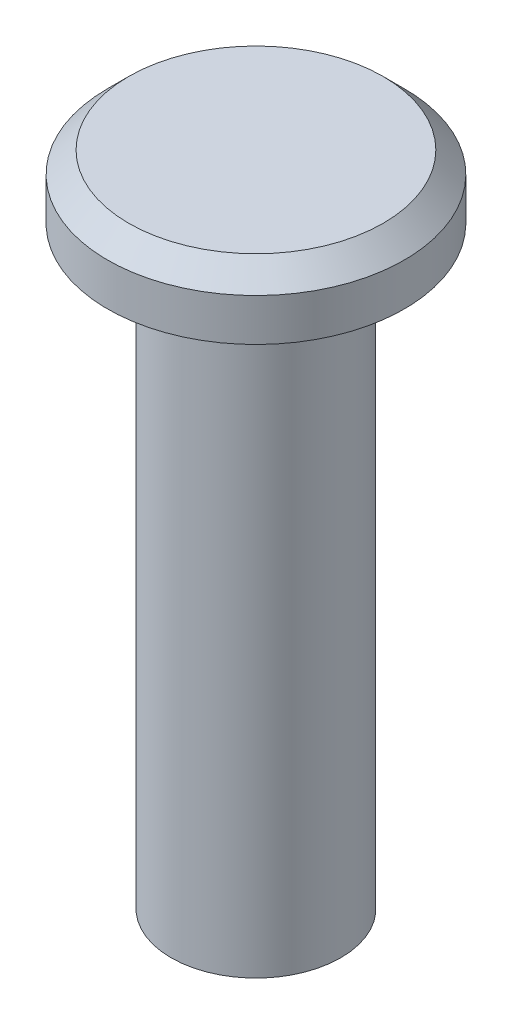
ISO-10303-21;
HEADER;
FILE_DESCRIPTION(('STEP AP214'),'2;1');
FILE_NAME('part.step','',(''),(''),'','','');
FILE_SCHEMA(('AUTOMOTIVE_DESIGN { 1 0 10303 214 1 1 1 1 }'));
ENDSEC;
DATA;
#1=APPLICATION_CONTEXT('core data for automotive mechanical design processes');
#2=APPLICATION_PROTOCOL_DEFINITION('international standard','automotive_design',2000,#1);
#3=PRODUCT_CONTEXT('',#1,'mechanical');
#4=PRODUCT('Part','Part','',(#3));
#5=PRODUCT_RELATED_PRODUCT_CATEGORY('part','',(#4));
#6=PRODUCT_DEFINITION_FORMATION('','',#4);
#7=PRODUCT_DEFINITION_CONTEXT('part definition',#1,'design');
#8=PRODUCT_DEFINITION('design','',#6,#7);
#9=PRODUCT_DEFINITION_SHAPE('','',#8);
#10=(LENGTH_UNIT() NAMED_UNIT(*) SI_UNIT(.MILLI.,.METRE.));
#11=(NAMED_UNIT(*) PLANE_ANGLE_UNIT() SI_UNIT($,.RADIAN.));
#12=(NAMED_UNIT(*) SI_UNIT($,.STERADIAN.) SOLID_ANGLE_UNIT());
#13=UNCERTAINTY_MEASURE_WITH_UNIT(LENGTH_MEASURE(1.E-05),#10,'distance_accuracy_value','');
#14=(GEOMETRIC_REPRESENTATION_CONTEXT(3) GLOBAL_UNCERTAINTY_ASSIGNED_CONTEXT((#13)) GLOBAL_UNIT_ASSIGNED_CONTEXT((#10,
#11,#12)) REPRESENTATION_CONTEXT('',''));
#15=CARTESIAN_POINT('',(0.,0.,0.));
#16=DIRECTION('',(0.,0.,1.));
#17=DIRECTION('',(1.,0.,0.));
#18=AXIS2_PLACEMENT_3D('',#15,#16,#17);
#19=CARTESIAN_POINT('',(0.,0.,0.));
#20=DIRECTION('',(0.,1.,0.));
#21=DIRECTION('',(-1.,0.,0.));
#22=AXIS2_PLACEMENT_3D('',#19,#20,#21);
#23=PLANE('',#22);
#24=CARTESIAN_POINT('',(0.,0.,0.));
#25=DIRECTION('',(0.,1.,0.));
#26=DIRECTION('',(-1.,0.,0.));
#27=AXIS2_PLACEMENT_3D('',#24,#25,#26);
#28=CIRCLE('',#27,4.);
#29=CARTESIAN_POINT('',(-4.,0.,0.));
#30=VERTEX_POINT('',#29);
#31=EDGE_CURVE('E10',#30,#30,#28,.T.);
#32=ORIENTED_EDGE('',*,*,#31,.F.);
#33=EDGE_LOOP('',(#32));
#34=FACE_BOUND('',#33,.T.);
#35=ADVANCED_FACE('F41',(#34),#23,.F.);
#36=CARTESIAN_POINT('',(0.,33.6049720126705,0.));
#37=DIRECTION('',(0.,1.,0.));
#38=DIRECTION('',(-1.,0.,0.));
#39=AXIS2_PLACEMENT_3D('',#36,#37,#38);
#40=CYLINDRICAL_SURFACE('',#39,4.);
#41=CARTESIAN_POINT('',(0.,28.,0.));
#42=DIRECTION('',(0.,1.,0.));
#43=DIRECTION('',(-1.,0.,0.));
#44=AXIS2_PLACEMENT_3D('',#41,#42,#43);
#45=CIRCLE('',#44,4.00000000000001);
#46=CARTESIAN_POINT('',(-4.00000000000001,28.,0.));
#47=VERTEX_POINT('',#46);
#48=EDGE_CURVE('E47',#47,#47,#45,.T.);
#49=ORIENTED_EDGE('',*,*,#48,.F.);
#50=EDGE_LOOP('',(#49));
#51=FACE_BOUND('',#50,.T.);
#52=ORIENTED_EDGE('',*,*,#31,.T.);
#53=EDGE_LOOP('',(#52));
#54=FACE_BOUND('',#53,.T.);
#55=ADVANCED_FACE('F80',(#51,#54),#40,.T.);
#56=CARTESIAN_POINT('',(4.00000000000001,28.,0.));
#57=DIRECTION('',(0.,1.,0.));
#58=DIRECTION('',(-1.,0.,0.));
#59=AXIS2_PLACEMENT_3D('',#56,#57,#58);
#60=PLANE('',#59);
#61=CARTESIAN_POINT('',(0.,28.,0.));
#62=DIRECTION('',(0.,1.,0.));
#63=DIRECTION('',(-1.,0.,0.));
#64=AXIS2_PLACEMENT_3D('',#61,#62,#63);
#65=CIRCLE('',#64,7.);
#66=CARTESIAN_POINT('',(-7.,28.,0.));
#67=VERTEX_POINT('',#66);
#68=EDGE_CURVE('E51',#67,#67,#65,.T.);
#69=ORIENTED_EDGE('',*,*,#68,.F.);
#70=EDGE_LOOP('',(#69));
#71=FACE_BOUND('',#70,.T.);
#72=ORIENTED_EDGE('',*,*,#48,.T.);
#73=EDGE_LOOP('',(#72));
#74=FACE_BOUND('',#73,.T.);
#75=ADVANCED_FACE('F75',(#71,#74),#60,.F.);
#76=CARTESIAN_POINT('',(0.,33.6049720126705,0.));
#77=DIRECTION('',(0.,1.,0.));
#78=DIRECTION('',(-1.,0.,0.));
#79=AXIS2_PLACEMENT_3D('',#76,#77,#78);
#80=CYLINDRICAL_SURFACE('',#79,7.);
#81=CARTESIAN_POINT('',(0.,30.,0.));
#82=DIRECTION('',(0.,1.,0.));
#83=DIRECTION('',(-1.,0.,0.));
#84=AXIS2_PLACEMENT_3D('',#81,#82,#83);
#85=CIRCLE('',#84,7.);
#86=CARTESIAN_POINT('',(-7.,30.,0.));
#87=VERTEX_POINT('',#86);
#88=EDGE_CURVE('E55',#87,#87,#85,.T.);
#89=ORIENTED_EDGE('',*,*,#88,.F.);
#90=EDGE_LOOP('',(#89));
#91=FACE_BOUND('',#90,.T.);
#92=ORIENTED_EDGE('',*,*,#68,.T.);
#93=EDGE_LOOP('',(#92));
#94=FACE_BOUND('',#93,.T.);
#95=ADVANCED_FACE('F69',(#91,#94),#80,.T.);
#96=CARTESIAN_POINT('',(0.,30.,0.));
#97=DIRECTION('',(0.,-1.,0.));
#98=DIRECTION('',(1.,0.,0.));
#99=AXIS2_PLACEMENT_3D('',#96,#97,#98);
#100=CONICAL_SURFACE('',#99,7.,0.785398163397448);
#101=CARTESIAN_POINT('',(0.,31.,0.));
#102=DIRECTION('',(0.,1.,0.));
#103=DIRECTION('',(-1.,0.,0.));
#104=AXIS2_PLACEMENT_3D('',#101,#102,#103);
#105=CIRCLE('',#104,6.);
#106=CARTESIAN_POINT('',(-6.,31.,0.));
#107=VERTEX_POINT('',#106);
#108=EDGE_CURVE('E60',#107,#107,#105,.T.);
#109=ORIENTED_EDGE('',*,*,#108,.F.);
#110=EDGE_LOOP('',(#109));
#111=FACE_BOUND('',#110,.T.);
#112=ORIENTED_EDGE('',*,*,#88,.T.);
#113=EDGE_LOOP('',(#112));
#114=FACE_BOUND('',#113,.T.);
#115=ADVANCED_FACE('F66',(#111,#114),#100,.T.);
#116=CARTESIAN_POINT('',(6.,31.,0.));
#117=DIRECTION('',(0.,-1.,0.));
#118=DIRECTION('',(1.,0.,0.));
#119=AXIS2_PLACEMENT_3D('',#116,#117,#118);
#120=PLANE('',#119);
#121=ORIENTED_EDGE('',*,*,#108,.T.);
#122=EDGE_LOOP('',(#121));
#123=FACE_BOUND('',#122,.T.);
#124=ADVANCED_FACE('F64',(#123),#120,.F.);
#125=CLOSED_SHELL('',(#35,#55,#75,#95,#115,#124));
#126=MANIFOLD_SOLID_BREP('B2',#125);
#127=ADVANCED_BREP_SHAPE_REPRESENTATION('',(#18,#126),#14);
#128=SHAPE_DEFINITION_REPRESENTATION(#9,#127);
ENDSEC;
END-ISO-10303-21;
